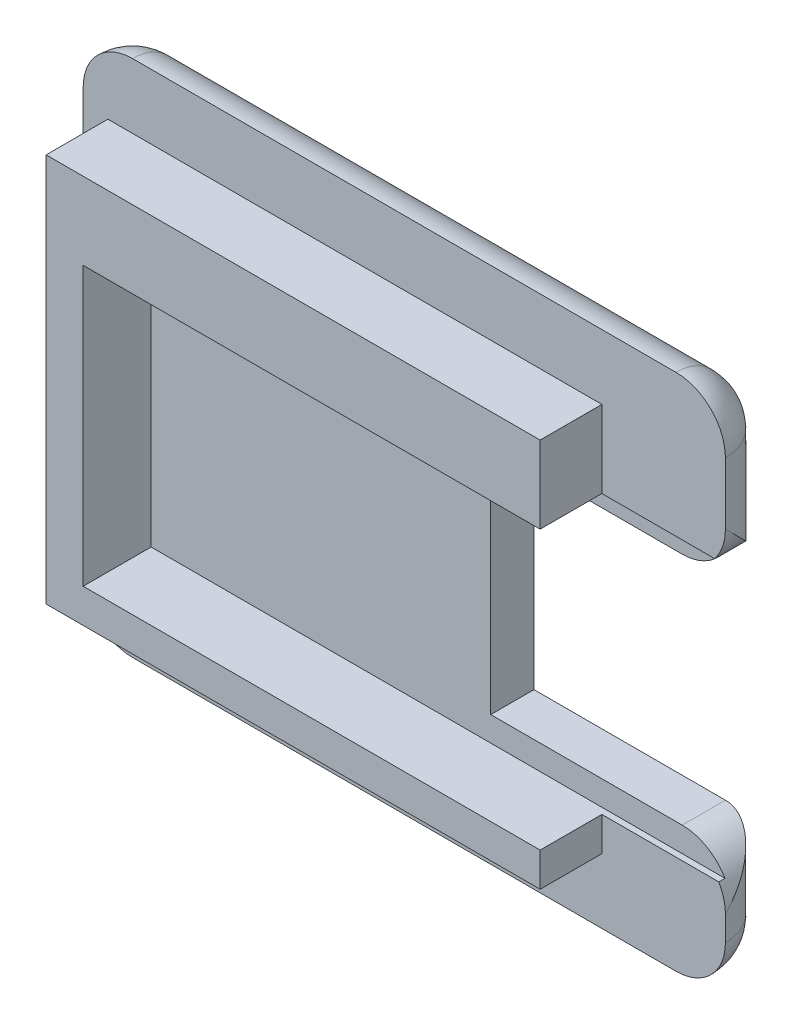
ISO-10303-21;
HEADER;
FILE_DESCRIPTION(('STEP AP214'),'2;1');
FILE_NAME('part.step','',(''),(''),'','','');
FILE_SCHEMA(('AUTOMOTIVE_DESIGN { 1 0 10303 214 1 1 1 1 }'));
ENDSEC;
DATA;
#1=APPLICATION_CONTEXT('core data for automotive mechanical design processes');
#2=APPLICATION_PROTOCOL_DEFINITION('international standard','automotive_design',2000,#1);
#3=PRODUCT_CONTEXT('',#1,'mechanical');
#4=PRODUCT('Part','Part','',(#3));
#5=PRODUCT_RELATED_PRODUCT_CATEGORY('part','',(#4));
#6=PRODUCT_DEFINITION_FORMATION('','',#4);
#7=PRODUCT_DEFINITION_CONTEXT('part definition',#1,'design');
#8=PRODUCT_DEFINITION('design','',#6,#7);
#9=PRODUCT_DEFINITION_SHAPE('','',#8);
#10=(LENGTH_UNIT() NAMED_UNIT(*) SI_UNIT(.MILLI.,.METRE.));
#11=(NAMED_UNIT(*) PLANE_ANGLE_UNIT() SI_UNIT($,.RADIAN.));
#12=(NAMED_UNIT(*) SI_UNIT($,.STERADIAN.) SOLID_ANGLE_UNIT());
#13=UNCERTAINTY_MEASURE_WITH_UNIT(LENGTH_MEASURE(1.E-05),#10,'distance_accuracy_value','');
#14=(GEOMETRIC_REPRESENTATION_CONTEXT(3) GLOBAL_UNCERTAINTY_ASSIGNED_CONTEXT((#13)) GLOBAL_UNIT_ASSIGNED_CONTEXT((#10,
#11,#12)) REPRESENTATION_CONTEXT('',''));
#15=CARTESIAN_POINT('',(0.,0.,0.));
#16=DIRECTION('',(0.,0.,1.));
#17=DIRECTION('',(1.,0.,0.));
#18=AXIS2_PLACEMENT_3D('',#15,#16,#17);
#19=CARTESIAN_POINT('',(16.,15.75,9.));
#20=DIRECTION('',(-1.,0.,0.));
#21=DIRECTION('',(0.,-1.,0.));
#22=AXIS2_PLACEMENT_3D('',#19,#20,#21);
#23=PLANE('',#22);
#24=DIRECTION('',(0.,1.,0.));
#25=VECTOR('',#24,1.);
#26=CARTESIAN_POINT('',(16.,15.75,4.));
#27=LINE('',#26,#25);
#28=CARTESIAN_POINT('',(16.,-15.75,4.));
#29=VERTEX_POINT('',#28);
#30=CARTESIAN_POINT('',(16.,-13.,4.));
#31=VERTEX_POINT('',#30);
#32=EDGE_CURVE('E256',#29,#31,#27,.T.);
#33=ORIENTED_EDGE('',*,*,#32,.T.);
#34=DIRECTION('',(0.,0.,1.));
#35=VECTOR('',#34,1.);
#36=CARTESIAN_POINT('',(16.,-13.,9.));
#37=LINE('',#36,#35);
#38=CARTESIAN_POINT('',(16.,-13.,9.));
#39=VERTEX_POINT('',#38);
#40=EDGE_CURVE('E241',#31,#39,#37,.T.);
#41=ORIENTED_EDGE('',*,*,#40,.T.);
#42=DIRECTION('',(0.,1.,0.));
#43=VECTOR('',#42,1.);
#44=CARTESIAN_POINT('',(16.,15.75,9.));
#45=LINE('',#44,#43);
#46=CARTESIAN_POINT('',(16.,-15.75,9.));
#47=VERTEX_POINT('',#46);
#48=EDGE_CURVE('E250',#47,#39,#45,.T.);
#49=ORIENTED_EDGE('',*,*,#48,.F.);
#50=DIRECTION('',(0.,0.,-1.));
#51=VECTOR('',#50,1.);
#52=CARTESIAN_POINT('',(16.,-15.75,9.));
#53=LINE('',#52,#51);
#54=EDGE_CURVE('E260',#47,#29,#53,.T.);
#55=ORIENTED_EDGE('',*,*,#54,.T.);
#56=EDGE_LOOP('',(#33,#41,#49,#55));
#57=FACE_BOUND('',#56,.T.);
#58=ADVANCED_FACE('F41',(#57),#23,.F.);
#59=CARTESIAN_POINT('',(0.,0.,4.));
#60=DIRECTION('',(0.,0.,1.));
#61=DIRECTION('',(1.,0.,0.));
#62=AXIS2_PLACEMENT_3D('',#59,#60,#61);
#63=PLANE('',#62);
#64=DIRECTION('',(0.,1.,0.));
#65=VECTOR('',#64,1.);
#66=CARTESIAN_POINT('',(26.,21.,4.));
#67=LINE('',#66,#65);
#68=CARTESIAN_POINT('',(26.,12.,4.));
#69=VERTEX_POINT('',#68);
#70=CARTESIAN_POINT('',(26.,17.,4.));
#71=VERTEX_POINT('',#70);
#72=EDGE_CURVE('E284',#69,#71,#67,.T.);
#73=ORIENTED_EDGE('',*,*,#72,.T.);
#74=CARTESIAN_POINT('',(22.,17.,4.));
#75=DIRECTION('',(0.,0.,1.));
#76=DIRECTION('',(1.,0.,0.));
#77=AXIS2_PLACEMENT_3D('',#74,#75,#76);
#78=CIRCLE('',#77,4.);
#79=CARTESIAN_POINT('',(22.,21.,4.));
#80=VERTEX_POINT('',#79);
#81=EDGE_CURVE('E305',#71,#80,#78,.T.);
#82=ORIENTED_EDGE('',*,*,#81,.T.);
#83=DIRECTION('',(-1.,0.,0.));
#84=VECTOR('',#83,1.);
#85=CARTESIAN_POINT('',(-26.,21.,4.));
#86=LINE('',#85,#84);
#87=CARTESIAN_POINT('',(-22.,21.,4.));
#88=VERTEX_POINT('',#87);
#89=EDGE_CURVE('E283',#80,#88,#86,.T.);
#90=ORIENTED_EDGE('',*,*,#89,.T.);
#91=CARTESIAN_POINT('',(-22.,17.,4.));
#92=DIRECTION('',(0.,0.,1.));
#93=DIRECTION('',(1.,0.,0.));
#94=AXIS2_PLACEMENT_3D('',#91,#92,#93);
#95=CIRCLE('',#94,4.);
#96=CARTESIAN_POINT('',(-26.,17.,4.));
#97=VERTEX_POINT('',#96);
#98=EDGE_CURVE('E292',#88,#97,#95,.T.);
#99=ORIENTED_EDGE('',*,*,#98,.T.);
#100=DIRECTION('',(0.,-1.,0.));
#101=VECTOR('',#100,1.);
#102=CARTESIAN_POINT('',(-26.,21.,4.));
#103=LINE('',#102,#101);
#104=CARTESIAN_POINT('',(-26.,-17.,4.));
#105=VERTEX_POINT('',#104);
#106=EDGE_CURVE('E287',#97,#105,#103,.T.);
#107=ORIENTED_EDGE('',*,*,#106,.T.);
#108=CARTESIAN_POINT('',(-22.,-17.,4.));
#109=DIRECTION('',(0.,0.,1.));
#110=DIRECTION('',(1.,0.,0.));
#111=AXIS2_PLACEMENT_3D('',#108,#109,#110);
#112=CIRCLE('',#111,4.);
#113=CARTESIAN_POINT('',(-22.,-21.,4.));
#114=VERTEX_POINT('',#113);
#115=EDGE_CURVE('E295',#105,#114,#112,.T.);
#116=ORIENTED_EDGE('',*,*,#115,.T.);
#117=DIRECTION('',(1.,0.,0.));
#118=VECTOR('',#117,1.);
#119=CARTESIAN_POINT('',(-26.,-21.,4.));
#120=LINE('',#119,#118);
#121=CARTESIAN_POINT('',(22.,-21.,4.));
#122=VERTEX_POINT('',#121);
#123=EDGE_CURVE('E288',#114,#122,#120,.T.);
#124=ORIENTED_EDGE('',*,*,#123,.T.);
#125=CARTESIAN_POINT('',(22.,-17.,4.));
#126=DIRECTION('',(0.,0.,1.));
#127=DIRECTION('',(1.,0.,0.));
#128=AXIS2_PLACEMENT_3D('',#125,#126,#127);
#129=CIRCLE('',#128,4.);
#130=CARTESIAN_POINT('',(26.,-17.,4.));
#131=VERTEX_POINT('',#130);
#132=EDGE_CURVE('E298',#122,#131,#129,.T.);
#133=ORIENTED_EDGE('',*,*,#132,.T.);
#134=CARTESIAN_POINT('',(26.,-15.,4.));
#135=VERTEX_POINT('',#134);
#136=EDGE_CURVE('E281',#131,#135,#67,.T.);
#137=ORIENTED_EDGE('',*,*,#136,.T.);
#138=CARTESIAN_POINT('',(22.,-15.,4.));
#139=DIRECTION('',(0.,0.,1.));
#140=DIRECTION('',(1.,0.,0.));
#141=AXIS2_PLACEMENT_3D('',#138,#139,#140);
#142=CIRCLE('',#141,4.);
#143=CARTESIAN_POINT('',(25.4641016151378,-13.,4.));
#144=VERTEX_POINT('',#143);
#145=EDGE_CURVE('E296',#135,#144,#142,.T.);
#146=ORIENTED_EDGE('',*,*,#145,.T.);
#147=DIRECTION('',(1.,0.,0.));
#148=VECTOR('',#147,1.);
#149=CARTESIAN_POINT('',(0.,-13.,4.));
#150=LINE('',#149,#148);
#151=EDGE_CURVE('E242',#31,#144,#150,.T.);
#152=ORIENTED_EDGE('',*,*,#151,.F.);
#153=ORIENTED_EDGE('',*,*,#32,.F.);
#154=DIRECTION('',(1.,0.,0.));
#155=VECTOR('',#154,1.);
#156=CARTESIAN_POINT('',(-24.,-15.75,4.));
#157=LINE('',#156,#155);
#158=CARTESIAN_POINT('',(-24.,-15.75,4.));
#159=VERTEX_POINT('',#158);
#160=EDGE_CURVE('E270',#159,#29,#157,.T.);
#161=ORIENTED_EDGE('',*,*,#160,.F.);
#162=DIRECTION('',(0.,-1.,0.));
#163=VECTOR('',#162,1.);
#164=CARTESIAN_POINT('',(-24.,15.75,4.));
#165=LINE('',#164,#163);
#166=CARTESIAN_POINT('',(-24.,15.75,4.));
#167=VERTEX_POINT('',#166);
#168=EDGE_CURVE('E263',#167,#159,#165,.T.);
#169=ORIENTED_EDGE('',*,*,#168,.F.);
#170=DIRECTION('',(-1.,0.,0.));
#171=VECTOR('',#170,1.);
#172=CARTESIAN_POINT('',(-24.,15.75,4.));
#173=LINE('',#172,#171);
#174=CARTESIAN_POINT('',(16.,15.75,4.));
#175=VERTEX_POINT('',#174);
#176=EDGE_CURVE('E264',#175,#167,#173,.T.);
#177=ORIENTED_EDGE('',*,*,#176,.F.);
#178=CARTESIAN_POINT('',(16.,9.5,4.));
#179=VERTEX_POINT('',#178);
#180=EDGE_CURVE('E246',#179,#175,#27,.T.);
#181=ORIENTED_EDGE('',*,*,#180,.F.);
#182=DIRECTION('',(-1.,0.,0.));
#183=VECTOR('',#182,1.);
#184=CARTESIAN_POINT('',(0.,9.5,4.));
#185=LINE('',#184,#183);
#186=CARTESIAN_POINT('',(25.1224989991992,9.5,4.));
#187=VERTEX_POINT('',#186);
#188=EDGE_CURVE('E237',#187,#179,#185,.T.);
#189=ORIENTED_EDGE('',*,*,#188,.F.);
#190=CARTESIAN_POINT('',(22.,12.,4.));
#191=DIRECTION('',(0.,0.,1.));
#192=DIRECTION('',(1.,0.,0.));
#193=AXIS2_PLACEMENT_3D('',#190,#191,#192);
#194=CIRCLE('',#193,4.);
#195=EDGE_CURVE('E297',#187,#69,#194,.T.);
#196=ORIENTED_EDGE('',*,*,#195,.T.);
#197=EDGE_LOOP('',(#73,#82,#90,#99,#107,#116,#124,#133,#137,#146,#152,#153,#161,#169,#177,#181,
#189,#196));
#198=FACE_BOUND('',#197,.T.);
#199=ADVANCED_FACE('F365',(#198),#63,.T.);
#200=CARTESIAN_POINT('',(0.,0.,0.));
#201=DIRECTION('',(0.,0.,1.));
#202=DIRECTION('',(1.,0.,0.));
#203=AXIS2_PLACEMENT_3D('',#200,#201,#202);
#204=PLANE('',#203);
#205=DIRECTION('',(-1.,0.,0.));
#206=VECTOR('',#205,1.);
#207=CARTESIAN_POINT('',(0.,17.,0.));
#208=LINE('',#207,#206);
#209=CARTESIAN_POINT('',(-22.,17.,0.));
#210=VERTEX_POINT('',#209);
#211=CARTESIAN_POINT('',(22.,17.,0.));
#212=VERTEX_POINT('',#211);
#213=EDGE_CURVE('E311',#210,#212,#208,.F.);
#214=ORIENTED_EDGE('',*,*,#213,.T.);
#215=DIRECTION('',(0.,1.,0.));
#216=VECTOR('',#215,1.);
#217=CARTESIAN_POINT('',(22.,0.,0.));
#218=LINE('',#217,#216);
#219=CARTESIAN_POINT('',(22.,8.,0.));
#220=VERTEX_POINT('',#219);
#221=EDGE_CURVE('E312',#212,#220,#218,.F.);
#222=ORIENTED_EDGE('',*,*,#221,.T.);
#223=DIRECTION('',(-1.,0.,0.));
#224=VECTOR('',#223,1.);
#225=CARTESIAN_POINT('',(0.,8.,0.));
#226=LINE('',#225,#224);
#227=CARTESIAN_POINT('',(6.50000000000001,8.,0.));
#228=VERTEX_POINT('',#227);
#229=EDGE_CURVE('E215',#220,#228,#226,.T.);
#230=ORIENTED_EDGE('',*,*,#229,.T.);
#231=DIRECTION('',(0.,-1.,0.));
#232=VECTOR('',#231,1.);
#233=CARTESIAN_POINT('',(6.50000000000001,0.,0.));
#234=LINE('',#233,#232);
#235=CARTESIAN_POINT('',(6.50000000000001,-11.,0.));
#236=VERTEX_POINT('',#235);
#237=EDGE_CURVE('E203',#228,#236,#234,.T.);
#238=ORIENTED_EDGE('',*,*,#237,.T.);
#239=DIRECTION('',(1.,0.,0.));
#240=VECTOR('',#239,1.);
#241=CARTESIAN_POINT('',(0.,-11.,0.));
#242=LINE('',#241,#240);
#243=CARTESIAN_POINT('',(22.,-11.,0.));
#244=VERTEX_POINT('',#243);
#245=EDGE_CURVE('E219',#236,#244,#242,.T.);
#246=ORIENTED_EDGE('',*,*,#245,.T.);
#247=DIRECTION('',(0.,1.,0.));
#248=VECTOR('',#247,1.);
#249=CARTESIAN_POINT('',(22.,0.,0.));
#250=LINE('',#249,#248);
#251=CARTESIAN_POINT('',(22.,-17.,0.));
#252=VERTEX_POINT('',#251);
#253=EDGE_CURVE('E307',#244,#252,#250,.F.);
#254=ORIENTED_EDGE('',*,*,#253,.T.);
#255=DIRECTION('',(1.,0.,0.));
#256=VECTOR('',#255,1.);
#257=CARTESIAN_POINT('',(0.,-17.,0.));
#258=LINE('',#257,#256);
#259=CARTESIAN_POINT('',(-22.,-17.,0.));
#260=VERTEX_POINT('',#259);
#261=EDGE_CURVE('E310',#252,#260,#258,.F.);
#262=ORIENTED_EDGE('',*,*,#261,.T.);
#263=DIRECTION('',(0.,-1.,0.));
#264=VECTOR('',#263,1.);
#265=CARTESIAN_POINT('',(-22.,0.,0.));
#266=LINE('',#265,#264);
#267=EDGE_CURVE('E304',#260,#210,#266,.F.);
#268=ORIENTED_EDGE('',*,*,#267,.T.);
#269=EDGE_LOOP('',(#214,#222,#230,#238,#246,#254,#262,#268));
#270=FACE_BOUND('',#269,.T.);
#271=ADVANCED_FACE('F450',(#270),#204,.F.);
#272=CARTESIAN_POINT('',(16.,9.5,9.));
#273=VERTEX_POINT('',#272);
#274=CARTESIAN_POINT('',(16.,15.75,9.));
#275=VERTEX_POINT('',#274);
#276=EDGE_CURVE('E252',#273,#275,#45,.T.);
#277=ORIENTED_EDGE('',*,*,#276,.F.);
#278=DIRECTION('',(0.,0.,-1.));
#279=VECTOR('',#278,1.);
#280=CARTESIAN_POINT('',(16.,9.5,9.));
#281=LINE('',#280,#279);
#282=EDGE_CURVE('E234',#273,#179,#281,.T.);
#283=ORIENTED_EDGE('',*,*,#282,.T.);
#284=ORIENTED_EDGE('',*,*,#180,.T.);
#285=DIRECTION('',(0.,0.,-1.));
#286=VECTOR('',#285,1.);
#287=CARTESIAN_POINT('',(16.,15.75,9.));
#288=LINE('',#287,#286);
#289=EDGE_CURVE('E276',#275,#175,#288,.T.);
#290=ORIENTED_EDGE('',*,*,#289,.F.);
#291=EDGE_LOOP('',(#277,#283,#284,#290));
#292=FACE_BOUND('',#291,.T.);
#293=ADVANCED_FACE('F389',(#292),#23,.F.);
#294=CARTESIAN_POINT('',(-24.,15.75,9.));
#295=DIRECTION('',(0.,-1.,0.));
#296=DIRECTION('',(0.,0.,-1.));
#297=AXIS2_PLACEMENT_3D('',#294,#295,#296);
#298=PLANE('',#297);
#299=ORIENTED_EDGE('',*,*,#176,.T.);
#300=DIRECTION('',(0.,0.,-1.));
#301=VECTOR('',#300,1.);
#302=CARTESIAN_POINT('',(-24.,15.75,9.));
#303=LINE('',#302,#301);
#304=CARTESIAN_POINT('',(-24.,15.75,9.));
#305=VERTEX_POINT('',#304);
#306=EDGE_CURVE('E273',#305,#167,#303,.T.);
#307=ORIENTED_EDGE('',*,*,#306,.F.);
#308=DIRECTION('',(-1.,0.,0.));
#309=VECTOR('',#308,1.);
#310=CARTESIAN_POINT('',(-24.,15.75,9.));
#311=LINE('',#310,#309);
#312=EDGE_CURVE('E249',#275,#305,#311,.T.);
#313=ORIENTED_EDGE('',*,*,#312,.F.);
#314=ORIENTED_EDGE('',*,*,#289,.T.);
#315=EDGE_LOOP('',(#299,#307,#313,#314));
#316=FACE_BOUND('',#315,.T.);
#317=ADVANCED_FACE('F385',(#316),#298,.F.);
#318=CARTESIAN_POINT('',(-24.,15.75,9.));
#319=DIRECTION('',(1.,0.,0.));
#320=DIRECTION('',(0.,1.,0.));
#321=AXIS2_PLACEMENT_3D('',#318,#319,#320);
#322=PLANE('',#321);
#323=ORIENTED_EDGE('',*,*,#168,.T.);
#324=DIRECTION('',(0.,0.,-1.));
#325=VECTOR('',#324,1.);
#326=CARTESIAN_POINT('',(-24.,-15.75,9.));
#327=LINE('',#326,#325);
#328=CARTESIAN_POINT('',(-24.,-15.75,9.));
#329=VERTEX_POINT('',#328);
#330=EDGE_CURVE('E275',#329,#159,#327,.T.);
#331=ORIENTED_EDGE('',*,*,#330,.F.);
#332=DIRECTION('',(0.,-1.,0.));
#333=VECTOR('',#332,1.);
#334=CARTESIAN_POINT('',(-24.,15.75,9.));
#335=LINE('',#334,#333);
#336=EDGE_CURVE('E254',#305,#329,#335,.T.);
#337=ORIENTED_EDGE('',*,*,#336,.F.);
#338=ORIENTED_EDGE('',*,*,#306,.T.);
#339=EDGE_LOOP('',(#323,#331,#337,#338));
#340=FACE_BOUND('',#339,.T.);
#341=ADVANCED_FACE('F377',(#340),#322,.F.);
#342=CARTESIAN_POINT('',(-24.,-15.75,9.));
#343=DIRECTION('',(0.,1.,0.));
#344=DIRECTION('',(0.,0.,1.));
#345=AXIS2_PLACEMENT_3D('',#342,#343,#344);
#346=PLANE('',#345);
#347=ORIENTED_EDGE('',*,*,#160,.T.);
#348=ORIENTED_EDGE('',*,*,#54,.F.);
#349=DIRECTION('',(1.,0.,0.));
#350=VECTOR('',#349,1.);
#351=CARTESIAN_POINT('',(-24.,-15.75,9.));
#352=LINE('',#351,#350);
#353=EDGE_CURVE('E253',#329,#47,#352,.T.);
#354=ORIENTED_EDGE('',*,*,#353,.F.);
#355=ORIENTED_EDGE('',*,*,#330,.T.);
#356=EDGE_LOOP('',(#347,#348,#354,#355));
#357=FACE_BOUND('',#356,.T.);
#358=ADVANCED_FACE('F374',(#357),#346,.F.);
#359=CARTESIAN_POINT('',(0.,0.,9.));
#360=DIRECTION('',(0.,0.,1.));
#361=DIRECTION('',(1.,0.,0.));
#362=AXIS2_PLACEMENT_3D('',#359,#360,#361);
#363=PLANE('',#362);
#364=DIRECTION('',(1.,0.,0.));
#365=VECTOR('',#364,1.);
#366=CARTESIAN_POINT('',(-21.,-13.,9.));
#367=LINE('',#366,#365);
#368=CARTESIAN_POINT('',(-21.,-13.,9.));
#369=VERTEX_POINT('',#368);
#370=EDGE_CURVE('E223',#369,#39,#367,.T.);
#371=ORIENTED_EDGE('',*,*,#370,.F.);
#372=DIRECTION('',(0.,-1.,0.));
#373=VECTOR('',#372,1.);
#374=CARTESIAN_POINT('',(-21.,9.5,9.));
#375=LINE('',#374,#373);
#376=CARTESIAN_POINT('',(-21.,9.5,9.));
#377=VERTEX_POINT('',#376);
#378=EDGE_CURVE('E218',#377,#369,#375,.T.);
#379=ORIENTED_EDGE('',*,*,#378,.F.);
#380=DIRECTION('',(-1.,0.,0.));
#381=VECTOR('',#380,1.);
#382=CARTESIAN_POINT('',(0.,9.5,9.));
#383=LINE('',#382,#381);
#384=EDGE_CURVE('E286',#273,#377,#383,.T.);
#385=ORIENTED_EDGE('',*,*,#384,.F.);
#386=ORIENTED_EDGE('',*,*,#276,.T.);
#387=ORIENTED_EDGE('',*,*,#312,.T.);
#388=ORIENTED_EDGE('',*,*,#336,.T.);
#389=ORIENTED_EDGE('',*,*,#353,.T.);
#390=ORIENTED_EDGE('',*,*,#48,.T.);
#391=EDGE_LOOP('',(#371,#379,#385,#386,#387,#388,#389,#390));
#392=FACE_BOUND('',#391,.T.);
#393=ADVANCED_FACE('F368',(#392),#363,.T.);
#394=CARTESIAN_POINT('',(0.,0.,3.5));
#395=DIRECTION('',(0.,0.,1.));
#396=DIRECTION('',(1.,0.,0.));
#397=AXIS2_PLACEMENT_3D('',#394,#395,#396);
#398=PLANE('',#397);
#399=DIRECTION('',(-1.,0.,0.));
#400=VECTOR('',#399,1.);
#401=CARTESIAN_POINT('',(6.50000000000001,8.,3.5));
#402=LINE('',#401,#400);
#403=CARTESIAN_POINT('',(22.,8.,3.5));
#404=VERTEX_POINT('',#403);
#405=CARTESIAN_POINT('',(6.50000000000001,8.,3.5));
#406=VERTEX_POINT('',#405);
#407=EDGE_CURVE('E187',#404,#406,#402,.T.);
#408=ORIENTED_EDGE('',*,*,#407,.F.);
#409=CARTESIAN_POINT('',(22.,12.,3.5));
#410=DIRECTION('',(0.,0.,1.));
#411=DIRECTION('',(1.,0.,0.));
#412=AXIS2_PLACEMENT_3D('',#409,#410,#411);
#413=CIRCLE('',#412,4.);
#414=CARTESIAN_POINT('',(25.1224989991992,9.5,3.5));
#415=VERTEX_POINT('',#414);
#416=EDGE_CURVE('E62',#404,#415,#413,.T.);
#417=ORIENTED_EDGE('',*,*,#416,.T.);
#418=DIRECTION('',(-1.,0.,0.));
#419=VECTOR('',#418,1.);
#420=CARTESIAN_POINT('',(-21.,9.5,3.5));
#421=LINE('',#420,#419);
#422=CARTESIAN_POINT('',(-21.,9.5,3.5));
#423=VERTEX_POINT('',#422);
#424=EDGE_CURVE('E217',#415,#423,#421,.T.);
#425=ORIENTED_EDGE('',*,*,#424,.T.);
#426=DIRECTION('',(0.,-1.,0.));
#427=VECTOR('',#426,1.);
#428=CARTESIAN_POINT('',(-21.,9.5,3.5));
#429=LINE('',#428,#427);
#430=CARTESIAN_POINT('',(-21.,-13.,3.5));
#431=VERTEX_POINT('',#430);
#432=EDGE_CURVE('E225',#423,#431,#429,.T.);
#433=ORIENTED_EDGE('',*,*,#432,.T.);
#434=DIRECTION('',(1.,0.,0.));
#435=VECTOR('',#434,1.);
#436=CARTESIAN_POINT('',(-21.,-13.,3.5));
#437=LINE('',#436,#435);
#438=CARTESIAN_POINT('',(25.4641016151378,-13.,3.5));
#439=VERTEX_POINT('',#438);
#440=EDGE_CURVE('E228',#431,#439,#437,.T.);
#441=ORIENTED_EDGE('',*,*,#440,.T.);
#442=CARTESIAN_POINT('',(22.,-15.,3.5));
#443=DIRECTION('',(0.,0.,1.));
#444=DIRECTION('',(1.,0.,0.));
#445=AXIS2_PLACEMENT_3D('',#442,#443,#444);
#446=CIRCLE('',#445,4.);
#447=CARTESIAN_POINT('',(22.,-11.,3.5));
#448=VERTEX_POINT('',#447);
#449=EDGE_CURVE('E317',#439,#448,#446,.T.);
#450=ORIENTED_EDGE('',*,*,#449,.T.);
#451=DIRECTION('',(1.,0.,0.));
#452=VECTOR('',#451,1.);
#453=CARTESIAN_POINT('',(6.50000000000001,-11.,3.5));
#454=LINE('',#453,#452);
#455=CARTESIAN_POINT('',(6.50000000000001,-11.,3.5));
#456=VERTEX_POINT('',#455);
#457=EDGE_CURVE('E201',#456,#448,#454,.T.);
#458=ORIENTED_EDGE('',*,*,#457,.F.);
#459=DIRECTION('',(0.,-1.,0.));
#460=VECTOR('',#459,1.);
#461=CARTESIAN_POINT('',(6.50000000000001,8.,3.5));
#462=LINE('',#461,#460);
#463=EDGE_CURVE('E194',#406,#456,#462,.T.);
#464=ORIENTED_EDGE('',*,*,#463,.F.);
#465=EDGE_LOOP('',(#408,#417,#425,#433,#441,#450,#458,#464));
#466=FACE_BOUND('',#465,.T.);
#467=ADVANCED_FACE('F210',(#466),#398,.T.);
#468=CARTESIAN_POINT('',(-21.,-13.,3.5));
#469=DIRECTION('',(0.,-1.,0.));
#470=DIRECTION('',(0.,0.,-1.));
#471=AXIS2_PLACEMENT_3D('',#468,#469,#470);
#472=PLANE('',#471);
#473=ORIENTED_EDGE('',*,*,#151,.T.);
#474=DIRECTION('',(0.,0.,1.));
#475=VECTOR('',#474,1.);
#476=CARTESIAN_POINT('',(25.4641016151378,-13.,4.));
#477=LINE('',#476,#475);
#478=EDGE_CURVE('E49',#144,#439,#477,.F.);
#479=ORIENTED_EDGE('',*,*,#478,.T.);
#480=ORIENTED_EDGE('',*,*,#440,.F.);
#481=DIRECTION('',(0.,0.,1.));
#482=VECTOR('',#481,1.);
#483=CARTESIAN_POINT('',(-21.,-13.,3.5));
#484=LINE('',#483,#482);
#485=EDGE_CURVE('E235',#431,#369,#484,.T.);
#486=ORIENTED_EDGE('',*,*,#485,.T.);
#487=ORIENTED_EDGE('',*,*,#370,.T.);
#488=ORIENTED_EDGE('',*,*,#40,.F.);
#489=EDGE_LOOP('',(#473,#479,#480,#486,#487,#488));
#490=FACE_BOUND('',#489,.T.);
#491=ADVANCED_FACE('F361',(#490),#472,.F.);
#492=CARTESIAN_POINT('',(-21.,9.5,3.5));
#493=DIRECTION('',(0.,1.,0.));
#494=DIRECTION('',(0.,0.,1.));
#495=AXIS2_PLACEMENT_3D('',#492,#493,#494);
#496=PLANE('',#495);
#497=ORIENTED_EDGE('',*,*,#424,.F.);
#498=DIRECTION('',(0.,0.,1.));
#499=VECTOR('',#498,1.);
#500=CARTESIAN_POINT('',(25.1224989991992,9.5,3.5));
#501=LINE('',#500,#499);
#502=EDGE_CURVE('E316',#415,#187,#501,.T.);
#503=ORIENTED_EDGE('',*,*,#502,.T.);
#504=ORIENTED_EDGE('',*,*,#188,.T.);
#505=ORIENTED_EDGE('',*,*,#282,.F.);
#506=ORIENTED_EDGE('',*,*,#384,.T.);
#507=DIRECTION('',(0.,0.,1.));
#508=VECTOR('',#507,1.);
#509=CARTESIAN_POINT('',(-21.,9.5,3.5));
#510=LINE('',#509,#508);
#511=EDGE_CURVE('E226',#423,#377,#510,.T.);
#512=ORIENTED_EDGE('',*,*,#511,.F.);
#513=EDGE_LOOP('',(#497,#503,#504,#505,#506,#512));
#514=FACE_BOUND('',#513,.T.);
#515=ADVANCED_FACE('F391',(#514),#496,.F.);
#516=CARTESIAN_POINT('',(-21.,9.5,3.5));
#517=DIRECTION('',(-1.,0.,0.));
#518=DIRECTION('',(0.,-1.,0.));
#519=AXIS2_PLACEMENT_3D('',#516,#517,#518);
#520=PLANE('',#519);
#521=ORIENTED_EDGE('',*,*,#378,.T.);
#522=ORIENTED_EDGE('',*,*,#485,.F.);
#523=ORIENTED_EDGE('',*,*,#432,.F.);
#524=ORIENTED_EDGE('',*,*,#511,.T.);
#525=EDGE_LOOP('',(#521,#522,#523,#524));
#526=FACE_BOUND('',#525,.T.);
#527=ADVANCED_FACE('F392',(#526),#520,.F.);
#528=CARTESIAN_POINT('',(6.50000000000001,-11.,-6.5));
#529=DIRECTION('',(0.,-1.,0.));
#530=DIRECTION('',(0.,0.,-1.));
#531=AXIS2_PLACEMENT_3D('',#528,#529,#530);
#532=PLANE('',#531);
#533=ORIENTED_EDGE('',*,*,#457,.T.);
#534=DIRECTION('',(0.,0.,1.));
#535=VECTOR('',#534,1.);
#536=CARTESIAN_POINT('',(22.,-11.,-6.5));
#537=LINE('',#536,#535);
#538=EDGE_CURVE('E11',#448,#244,#537,.F.);
#539=ORIENTED_EDGE('',*,*,#538,.T.);
#540=ORIENTED_EDGE('',*,*,#245,.F.);
#541=DIRECTION('',(0.,0.,1.));
#542=VECTOR('',#541,1.);
#543=CARTESIAN_POINT('',(6.50000000000001,-11.,-6.5));
#544=LINE('',#543,#542);
#545=EDGE_CURVE('E204',#236,#456,#544,.T.);
#546=ORIENTED_EDGE('',*,*,#545,.T.);
#547=EDGE_LOOP('',(#533,#539,#540,#546));
#548=FACE_BOUND('',#547,.T.);
#549=ADVANCED_FACE('F549',(#548),#532,.F.);
#550=CARTESIAN_POINT('',(6.50000000000001,8.,-6.5));
#551=DIRECTION('',(-1.,0.,0.));
#552=DIRECTION('',(0.,-1.,0.));
#553=AXIS2_PLACEMENT_3D('',#550,#551,#552);
#554=PLANE('',#553);
#555=DIRECTION('',(0.,0.,1.));
#556=VECTOR('',#555,1.);
#557=CARTESIAN_POINT('',(6.50000000000001,8.,-6.5));
#558=LINE('',#557,#556);
#559=EDGE_CURVE('E188',#228,#406,#558,.T.);
#560=ORIENTED_EDGE('',*,*,#559,.T.);
#561=ORIENTED_EDGE('',*,*,#463,.T.);
#562=ORIENTED_EDGE('',*,*,#545,.F.);
#563=ORIENTED_EDGE('',*,*,#237,.F.);
#564=EDGE_LOOP('',(#560,#561,#562,#563));
#565=FACE_BOUND('',#564,.T.);
#566=ADVANCED_FACE('F198',(#565),#554,.F.);
#567=CARTESIAN_POINT('',(6.50000000000001,8.,-6.5));
#568=DIRECTION('',(0.,1.,0.));
#569=DIRECTION('',(0.,0.,1.));
#570=AXIS2_PLACEMENT_3D('',#567,#568,#569);
#571=PLANE('',#570);
#572=ORIENTED_EDGE('',*,*,#229,.F.);
#573=DIRECTION('',(0.,0.,1.));
#574=VECTOR('',#573,1.);
#575=CARTESIAN_POINT('',(22.,8.,-6.5));
#576=LINE('',#575,#574);
#577=EDGE_CURVE('E195',#220,#404,#576,.T.);
#578=ORIENTED_EDGE('',*,*,#577,.T.);
#579=ORIENTED_EDGE('',*,*,#407,.T.);
#580=ORIENTED_EDGE('',*,*,#559,.F.);
#581=EDGE_LOOP('',(#572,#578,#579,#580));
#582=FACE_BOUND('',#581,.T.);
#583=ADVANCED_FACE('F186',(#582),#571,.F.);
#584=CARTESIAN_POINT('',(22.,-15.,4.));
#585=DIRECTION('',(0.,0.,1.));
#586=DIRECTION('',(1.,0.,0.));
#587=AXIS2_PLACEMENT_3D('',#584,#585,#586);
#588=CYLINDRICAL_SURFACE('',#587,4.);
#589=ORIENTED_EDGE('',*,*,#478,.F.);
#590=ORIENTED_EDGE('',*,*,#145,.F.);
#591=CARTESIAN_POINT('',(22.,-15.,4.));
#592=DIRECTION('',(0.,0.707106781186547,0.707106781186547));
#593=DIRECTION('',(0.,-0.707106781186547,0.707106781186547));
#594=AXIS2_PLACEMENT_3D('',#591,#592,#593);
#595=ELLIPSE('',#594,5.65685424949238,4.);
#596=EDGE_CURVE('E44',#244,#135,#595,.F.);
#597=ORIENTED_EDGE('',*,*,#596,.F.);
#598=ORIENTED_EDGE('',*,*,#538,.F.);
#599=ORIENTED_EDGE('',*,*,#449,.F.);
#600=EDGE_LOOP('',(#589,#590,#597,#598,#599));
#601=FACE_BOUND('',#600,.T.);
#602=ADVANCED_FACE('F43',(#601),#588,.T.);
#603=CARTESIAN_POINT('',(22.,21.,4.));
#604=DIRECTION('',(0.,1.,0.));
#605=DIRECTION('',(0.,0.,1.));
#606=AXIS2_PLACEMENT_3D('',#603,#604,#605);
#607=CYLINDRICAL_SURFACE('',#606,4.);
#608=ORIENTED_EDGE('',*,*,#596,.T.);
#609=ORIENTED_EDGE('',*,*,#136,.F.);
#610=CARTESIAN_POINT('',(22.,-17.,4.));
#611=DIRECTION('',(0.,-1.,0.));
#612=DIRECTION('',(1.,0.,0.));
#613=AXIS2_PLACEMENT_3D('',#610,#611,#612);
#614=CIRCLE('',#613,4.);
#615=EDGE_CURVE('E344',#252,#131,#614,.T.);
#616=ORIENTED_EDGE('',*,*,#615,.F.);
#617=ORIENTED_EDGE('',*,*,#253,.F.);
#618=EDGE_LOOP('',(#608,#609,#616,#617));
#619=FACE_BOUND('',#618,.T.);
#620=ADVANCED_FACE('F351',(#619),#607,.T.);
#621=CARTESIAN_POINT('',(22.,-17.,4.));
#622=DIRECTION('',(1.,0.,0.));
#623=DIRECTION('',(0.,1.,0.));
#624=AXIS2_PLACEMENT_3D('',#621,#622,#623);
#625=SPHERICAL_SURFACE('',#624,4.);
#626=ORIENTED_EDGE('',*,*,#615,.T.);
#627=ORIENTED_EDGE('',*,*,#132,.F.);
#628=CARTESIAN_POINT('',(22.,-17.,4.));
#629=DIRECTION('',(1.,0.,0.));
#630=DIRECTION('',(0.,0.,-1.));
#631=AXIS2_PLACEMENT_3D('',#628,#629,#630);
#632=CIRCLE('',#631,4.);
#633=EDGE_CURVE('E345',#252,#122,#632,.F.);
#634=ORIENTED_EDGE('',*,*,#633,.F.);
#635=EDGE_LOOP('',(#626,#627,#634));
#636=FACE_BOUND('',#635,.T.);
#637=ADVANCED_FACE('F435',(#636),#625,.T.);
#638=CARTESIAN_POINT('',(-26.,-17.,4.));
#639=DIRECTION('',(1.,0.,0.));
#640=DIRECTION('',(0.,0.,-1.));
#641=AXIS2_PLACEMENT_3D('',#638,#639,#640);
#642=CYLINDRICAL_SURFACE('',#641,4.);
#643=ORIENTED_EDGE('',*,*,#633,.T.);
#644=ORIENTED_EDGE('',*,*,#123,.F.);
#645=CARTESIAN_POINT('',(-22.,-17.,4.));
#646=DIRECTION('',(-1.,0.,0.));
#647=DIRECTION('',(0.,0.,1.));
#648=AXIS2_PLACEMENT_3D('',#645,#646,#647);
#649=CIRCLE('',#648,4.);
#650=EDGE_CURVE('E339',#260,#114,#649,.T.);
#651=ORIENTED_EDGE('',*,*,#650,.F.);
#652=ORIENTED_EDGE('',*,*,#261,.F.);
#653=EDGE_LOOP('',(#643,#644,#651,#652));
#654=FACE_BOUND('',#653,.T.);
#655=ADVANCED_FACE('F431',(#654),#642,.T.);
#656=CARTESIAN_POINT('',(-22.,-17.,4.));
#657=DIRECTION('',(0.,-1.,0.));
#658=DIRECTION('',(0.,0.,-1.));
#659=AXIS2_PLACEMENT_3D('',#656,#657,#658);
#660=SPHERICAL_SURFACE('',#659,4.);
#661=ORIENTED_EDGE('',*,*,#650,.T.);
#662=ORIENTED_EDGE('',*,*,#115,.F.);
#663=CARTESIAN_POINT('',(-22.,-17.,4.));
#664=DIRECTION('',(0.,-1.,0.));
#665=DIRECTION('',(0.,0.,-1.));
#666=AXIS2_PLACEMENT_3D('',#663,#664,#665);
#667=CIRCLE('',#666,4.);
#668=EDGE_CURVE('E337',#260,#105,#667,.F.);
#669=ORIENTED_EDGE('',*,*,#668,.F.);
#670=EDGE_LOOP('',(#661,#662,#669));
#671=FACE_BOUND('',#670,.T.);
#672=ADVANCED_FACE('F430',(#671),#660,.T.);
#673=CARTESIAN_POINT('',(-22.,21.,4.));
#674=DIRECTION('',(0.,-1.,0.));
#675=DIRECTION('',(1.,0.,0.));
#676=AXIS2_PLACEMENT_3D('',#673,#674,#675);
#677=CYLINDRICAL_SURFACE('',#676,4.);
#678=ORIENTED_EDGE('',*,*,#668,.T.);
#679=ORIENTED_EDGE('',*,*,#106,.F.);
#680=CARTESIAN_POINT('',(-22.,17.,4.));
#681=DIRECTION('',(0.,1.,0.));
#682=DIRECTION('',(0.,0.,1.));
#683=AXIS2_PLACEMENT_3D('',#680,#681,#682);
#684=CIRCLE('',#683,4.);
#685=EDGE_CURVE('E333',#210,#97,#684,.T.);
#686=ORIENTED_EDGE('',*,*,#685,.F.);
#687=ORIENTED_EDGE('',*,*,#267,.F.);
#688=EDGE_LOOP('',(#678,#679,#686,#687));
#689=FACE_BOUND('',#688,.T.);
#690=ADVANCED_FACE('F422',(#689),#677,.T.);
#691=CARTESIAN_POINT('',(-22.,17.,4.));
#692=DIRECTION('',(-1.,0.,0.));
#693=DIRECTION('',(0.,0.,1.));
#694=AXIS2_PLACEMENT_3D('',#691,#692,#693);
#695=SPHERICAL_SURFACE('',#694,4.);
#696=ORIENTED_EDGE('',*,*,#685,.T.);
#697=ORIENTED_EDGE('',*,*,#98,.F.);
#698=CARTESIAN_POINT('',(-22.,17.,4.));
#699=DIRECTION('',(-1.,0.,0.));
#700=DIRECTION('',(0.,0.,1.));
#701=AXIS2_PLACEMENT_3D('',#698,#699,#700);
#702=CIRCLE('',#701,4.);
#703=EDGE_CURVE('E327',#210,#88,#702,.F.);
#704=ORIENTED_EDGE('',*,*,#703,.F.);
#705=EDGE_LOOP('',(#696,#697,#704));
#706=FACE_BOUND('',#705,.T.);
#707=ADVANCED_FACE('F418',(#706),#695,.T.);
#708=CARTESIAN_POINT('',(22.,12.,-6.5));
#709=DIRECTION('',(0.,0.,1.));
#710=DIRECTION('',(1.,0.,0.));
#711=AXIS2_PLACEMENT_3D('',#708,#709,#710);
#712=CYLINDRICAL_SURFACE('',#711,4.);
#713=ORIENTED_EDGE('',*,*,#416,.F.);
#714=ORIENTED_EDGE('',*,*,#577,.F.);
#715=CARTESIAN_POINT('',(22.,12.,4.));
#716=DIRECTION('',(0.,-0.707106781186547,0.707106781186547));
#717=DIRECTION('',(0.,0.707106781186547,0.707106781186547));
#718=AXIS2_PLACEMENT_3D('',#715,#716,#717);
#719=ELLIPSE('',#718,5.65685424949238,4.);
#720=EDGE_CURVE('E326',#69,#220,#719,.F.);
#721=ORIENTED_EDGE('',*,*,#720,.F.);
#722=ORIENTED_EDGE('',*,*,#195,.F.);
#723=ORIENTED_EDGE('',*,*,#502,.F.);
#724=EDGE_LOOP('',(#713,#714,#721,#722,#723));
#725=FACE_BOUND('',#724,.T.);
#726=ADVANCED_FACE('F399',(#725),#712,.T.);
#727=CARTESIAN_POINT('',(-26.,17.,4.));
#728=DIRECTION('',(-1.,0.,0.));
#729=DIRECTION('',(0.,0.,1.));
#730=AXIS2_PLACEMENT_3D('',#727,#728,#729);
#731=CYLINDRICAL_SURFACE('',#730,4.);
#732=ORIENTED_EDGE('',*,*,#703,.T.);
#733=ORIENTED_EDGE('',*,*,#89,.F.);
#734=CARTESIAN_POINT('',(22.,17.,4.));
#735=DIRECTION('',(1.,0.,0.));
#736=DIRECTION('',(0.,1.,0.));
#737=AXIS2_PLACEMENT_3D('',#734,#735,#736);
#738=CIRCLE('',#737,4.);
#739=EDGE_CURVE('E322',#212,#80,#738,.T.);
#740=ORIENTED_EDGE('',*,*,#739,.F.);
#741=ORIENTED_EDGE('',*,*,#213,.F.);
#742=EDGE_LOOP('',(#732,#733,#740,#741));
#743=FACE_BOUND('',#742,.T.);
#744=ADVANCED_FACE('F415',(#743),#731,.T.);
#745=CARTESIAN_POINT('',(22.,21.,4.));
#746=DIRECTION('',(0.,1.,0.));
#747=DIRECTION('',(0.,0.,1.));
#748=AXIS2_PLACEMENT_3D('',#745,#746,#747);
#749=CYLINDRICAL_SURFACE('',#748,4.);
#750=ORIENTED_EDGE('',*,*,#720,.T.);
#751=ORIENTED_EDGE('',*,*,#221,.F.);
#752=CARTESIAN_POINT('',(22.,17.,4.));
#753=DIRECTION('',(0.,1.,0.));
#754=DIRECTION('',(0.,0.,1.));
#755=AXIS2_PLACEMENT_3D('',#752,#753,#754);
#756=CIRCLE('',#755,4.);
#757=EDGE_CURVE('E325',#71,#212,#756,.T.);
#758=ORIENTED_EDGE('',*,*,#757,.F.);
#759=ORIENTED_EDGE('',*,*,#72,.F.);
#760=EDGE_LOOP('',(#750,#751,#758,#759));
#761=FACE_BOUND('',#760,.T.);
#762=ADVANCED_FACE('F408',(#761),#749,.T.);
#763=CARTESIAN_POINT('',(22.,17.,4.));
#764=DIRECTION('',(0.,0.,-1.));
#765=DIRECTION('',(-1.,0.,0.));
#766=AXIS2_PLACEMENT_3D('',#763,#764,#765);
#767=SPHERICAL_SURFACE('',#766,4.);
#768=ORIENTED_EDGE('',*,*,#757,.T.);
#769=ORIENTED_EDGE('',*,*,#739,.T.);
#770=ORIENTED_EDGE('',*,*,#81,.F.);
#771=EDGE_LOOP('',(#768,#769,#770));
#772=FACE_BOUND('',#771,.T.);
#773=ADVANCED_FACE('F409',(#772),#767,.T.);
#774=CLOSED_SHELL('',(#58,#199,#271,#293,#317,#341,#358,#393,#467,#491,#515,#527,#549,#566,#583,
#602,#620,#637,#655,#672,#690,#707,#726,#744,#762,#773));
#775=MANIFOLD_SOLID_BREP('B2',#774);
#776=ADVANCED_BREP_SHAPE_REPRESENTATION('',(#18,#775),#14);
#777=SHAPE_DEFINITION_REPRESENTATION(#9,#776);
ENDSEC;
END-ISO-10303-21;
